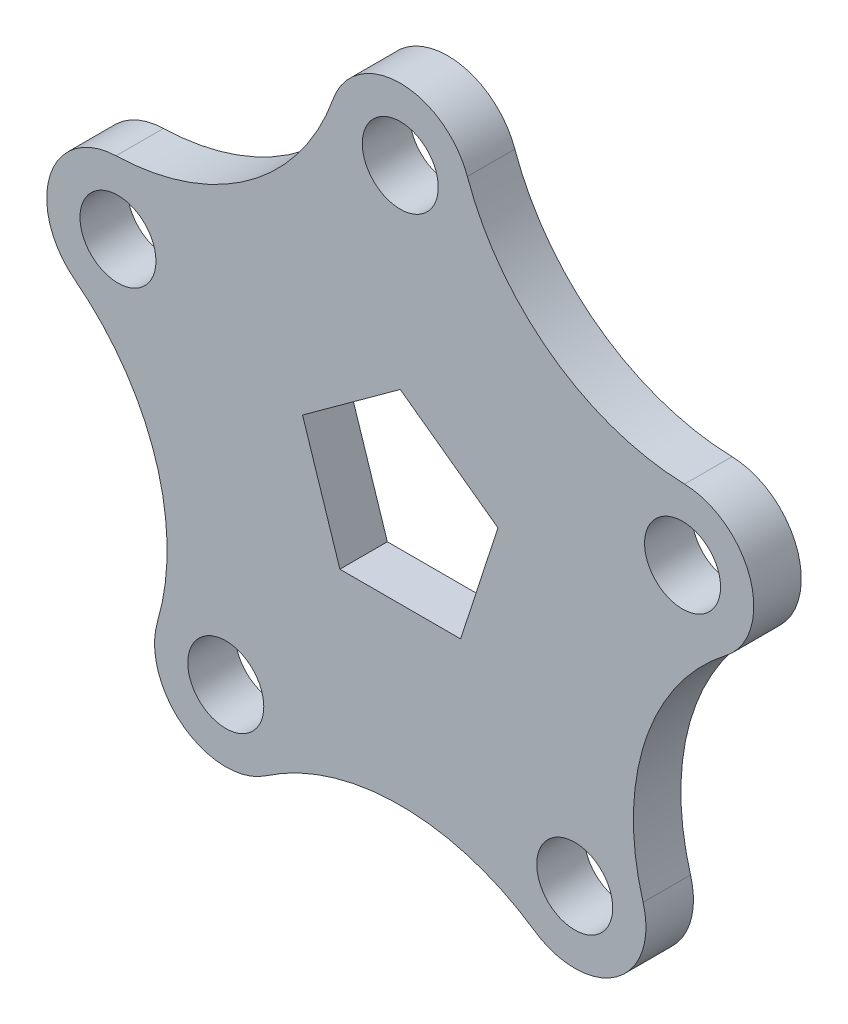
ISO-10303-21;
HEADER;
FILE_DESCRIPTION(('STEP AP214'),'2;1');
FILE_NAME('part.step','',(''),(''),'','','');
FILE_SCHEMA(('AUTOMOTIVE_DESIGN { 1 0 10303 214 1 1 1 1 }'));
ENDSEC;
DATA;
#1=APPLICATION_CONTEXT('core data for automotive mechanical design processes');
#2=APPLICATION_PROTOCOL_DEFINITION('international standard','automotive_design',2000,#1);
#3=PRODUCT_CONTEXT('',#1,'mechanical');
#4=PRODUCT('Part','Part','',(#3));
#5=PRODUCT_RELATED_PRODUCT_CATEGORY('part','',(#4));
#6=PRODUCT_DEFINITION_FORMATION('','',#4);
#7=PRODUCT_DEFINITION_CONTEXT('part definition',#1,'design');
#8=PRODUCT_DEFINITION('design','',#6,#7);
#9=PRODUCT_DEFINITION_SHAPE('','',#8);
#10=(LENGTH_UNIT() NAMED_UNIT(*) SI_UNIT(.MILLI.,.METRE.));
#11=(NAMED_UNIT(*) PLANE_ANGLE_UNIT() SI_UNIT($,.RADIAN.));
#12=(NAMED_UNIT(*) SI_UNIT($,.STERADIAN.) SOLID_ANGLE_UNIT());
#13=UNCERTAINTY_MEASURE_WITH_UNIT(LENGTH_MEASURE(1.E-05),#10,'distance_accuracy_value','');
#14=(GEOMETRIC_REPRESENTATION_CONTEXT(3) GLOBAL_UNCERTAINTY_ASSIGNED_CONTEXT((#13)) GLOBAL_UNIT_ASSIGNED_CONTEXT((#10,
#11,#12)) REPRESENTATION_CONTEXT('',''));
#15=CARTESIAN_POINT('',(0.,0.,0.));
#16=DIRECTION('',(0.,0.,1.));
#17=DIRECTION('',(1.,0.,0.));
#18=AXIS2_PLACEMENT_3D('',#15,#16,#17);
#19=CARTESIAN_POINT('',(16.6434890351652,-5.40779740156155,10.));
#20=DIRECTION('',(-0.951056516295154,0.309016994374946,0.));
#21=DIRECTION('',(-0.309016994374946,-0.951056516295154,0.));
#22=AXIS2_PLACEMENT_3D('',#19,#20,#21);
#23=PLANE('',#22);
#24=DIRECTION('',(0.309016994374946,0.951056516295154,0.));
#25=VECTOR('',#24,1.);
#26=CARTESIAN_POINT('',(16.6434890351652,-5.40779740156155,0.));
#27=LINE('',#26,#25);
#28=CARTESIAN_POINT('',(12.7144942400938,-17.5,0.));
#29=VERTEX_POINT('',#28);
#30=CARTESIAN_POINT('',(20.5724838302366,6.68440519687686,0.));
#31=VERTEX_POINT('',#30);
#32=EDGE_CURVE('E230',#29,#31,#27,.T.);
#33=ORIENTED_EDGE('',*,*,#32,.F.);
#34=DIRECTION('',(0.,0.,-1.));
#35=VECTOR('',#34,1.);
#36=CARTESIAN_POINT('',(12.7144942400938,-17.5,10.));
#37=LINE('',#36,#35);
#38=CARTESIAN_POINT('',(12.7144942400938,-17.5,10.));
#39=VERTEX_POINT('',#38);
#40=EDGE_CURVE('E11',#39,#29,#37,.T.);
#41=ORIENTED_EDGE('',*,*,#40,.F.);
#42=DIRECTION('',(0.309016994374946,0.951056516295154,0.));
#43=VECTOR('',#42,1.);
#44=CARTESIAN_POINT('',(16.6434890351652,-5.40779740156155,10.));
#45=LINE('',#44,#43);
#46=CARTESIAN_POINT('',(20.5724838302366,6.68440519687686,10.));
#47=VERTEX_POINT('',#46);
#48=EDGE_CURVE('E309',#39,#47,#45,.T.);
#49=ORIENTED_EDGE('',*,*,#48,.T.);
#50=DIRECTION('',(0.,0.,-1.));
#51=VECTOR('',#50,1.);
#52=CARTESIAN_POINT('',(20.5724838302366,6.68440519687686,10.));
#53=LINE('',#52,#51);
#54=EDGE_CURVE('E58',#47,#31,#53,.T.);
#55=ORIENTED_EDGE('',*,*,#54,.T.);
#56=EDGE_LOOP('',(#33,#41,#49,#55));
#57=FACE_BOUND('',#56,.T.);
#58=ADVANCED_FACE('F41',(#57),#23,.T.);
#59=CARTESIAN_POINT('',(0.,-17.5,10.));
#60=DIRECTION('',(0.,1.,0.));
#61=DIRECTION('',(-1.,0.,0.));
#62=AXIS2_PLACEMENT_3D('',#59,#60,#61);
#63=PLANE('',#62);
#64=DIRECTION('',(1.,0.,0.));
#65=VECTOR('',#64,1.);
#66=CARTESIAN_POINT('',(0.,-17.5,0.));
#67=LINE('',#66,#65);
#68=CARTESIAN_POINT('',(-12.7144942400938,-17.5,0.));
#69=VERTEX_POINT('',#68);
#70=EDGE_CURVE('E227',#69,#29,#67,.T.);
#71=ORIENTED_EDGE('',*,*,#70,.F.);
#72=DIRECTION('',(0.,0.,-1.));
#73=VECTOR('',#72,1.);
#74=CARTESIAN_POINT('',(-12.7144942400938,-17.5,10.));
#75=LINE('',#74,#73);
#76=CARTESIAN_POINT('',(-12.7144942400938,-17.5,10.));
#77=VERTEX_POINT('',#76);
#78=EDGE_CURVE('E51',#77,#69,#75,.T.);
#79=ORIENTED_EDGE('',*,*,#78,.F.);
#80=DIRECTION('',(1.,0.,0.));
#81=VECTOR('',#80,1.);
#82=CARTESIAN_POINT('',(0.,-17.5,10.));
#83=LINE('',#82,#81);
#84=EDGE_CURVE('E172',#77,#39,#83,.T.);
#85=ORIENTED_EDGE('',*,*,#84,.T.);
#86=ORIENTED_EDGE('',*,*,#40,.T.);
#87=EDGE_LOOP('',(#71,#79,#85,#86));
#88=FACE_BOUND('',#87,.T.);
#89=ADVANCED_FACE('F315',(#88),#63,.T.);
#90=CARTESIAN_POINT('',(-16.6434890351652,-5.4077974015616,10.));
#91=DIRECTION('',(0.951056516295153,0.309016994374948,0.));
#92=DIRECTION('',(-0.309016994374948,0.951056516295153,0.));
#93=AXIS2_PLACEMENT_3D('',#90,#91,#92);
#94=PLANE('',#93);
#95=DIRECTION('',(0.309016994374948,-0.951056516295153,0.));
#96=VECTOR('',#95,1.);
#97=CARTESIAN_POINT('',(-16.6434890351652,-5.4077974015616,0.));
#98=LINE('',#97,#96);
#99=CARTESIAN_POINT('',(-20.5724838302366,6.68440519687681,0.));
#100=VERTEX_POINT('',#99);
#101=EDGE_CURVE('E161',#100,#69,#98,.T.);
#102=ORIENTED_EDGE('',*,*,#101,.F.);
#103=DIRECTION('',(0.,0.,-1.));
#104=VECTOR('',#103,1.);
#105=CARTESIAN_POINT('',(-20.5724838302366,6.68440519687681,10.));
#106=LINE('',#105,#104);
#107=CARTESIAN_POINT('',(-20.5724838302366,6.68440519687681,10.));
#108=VERTEX_POINT('',#107);
#109=EDGE_CURVE('E157',#108,#100,#106,.T.);
#110=ORIENTED_EDGE('',*,*,#109,.F.);
#111=DIRECTION('',(0.309016994374948,-0.951056516295153,0.));
#112=VECTOR('',#111,1.);
#113=CARTESIAN_POINT('',(-16.6434890351652,-5.4077974015616,10.));
#114=LINE('',#113,#112);
#115=EDGE_CURVE('E159',#108,#77,#114,.T.);
#116=ORIENTED_EDGE('',*,*,#115,.T.);
#117=ORIENTED_EDGE('',*,*,#78,.T.);
#118=EDGE_LOOP('',(#102,#110,#116,#117));
#119=FACE_BOUND('',#118,.T.);
#120=ADVANCED_FACE('F156',(#119),#94,.T.);
#121=CARTESIAN_POINT('',(-10.2862419151183,14.1577974015616,10.));
#122=DIRECTION('',(0.587785252292474,-0.809016994374947,0.));
#123=DIRECTION('',(0.809016994374947,0.587785252292474,0.));
#124=AXIS2_PLACEMENT_3D('',#121,#122,#123);
#125=PLANE('',#124);
#126=DIRECTION('',(-0.809016994374947,-0.587785252292474,0.));
#127=VECTOR('',#126,1.);
#128=CARTESIAN_POINT('',(-10.2862419151183,14.1577974015616,0.));
#129=LINE('',#128,#127);
#130=CARTESIAN_POINT('',(0.,21.6311896062463,0.));
#131=VERTEX_POINT('',#130);
#132=EDGE_CURVE('E232',#131,#100,#129,.T.);
#133=ORIENTED_EDGE('',*,*,#132,.F.);
#134=DIRECTION('',(0.,0.,-1.));
#135=VECTOR('',#134,1.);
#136=CARTESIAN_POINT('',(0.,21.6311896062463,10.));
#137=LINE('',#136,#135);
#138=CARTESIAN_POINT('',(0.,21.6311896062463,10.));
#139=VERTEX_POINT('',#138);
#140=EDGE_CURVE('E106',#139,#131,#137,.T.);
#141=ORIENTED_EDGE('',*,*,#140,.F.);
#142=DIRECTION('',(-0.809016994374947,-0.587785252292474,0.));
#143=VECTOR('',#142,1.);
#144=CARTESIAN_POINT('',(-10.2862419151183,14.1577974015616,10.));
#145=LINE('',#144,#143);
#146=EDGE_CURVE('E171',#139,#108,#145,.T.);
#147=ORIENTED_EDGE('',*,*,#146,.T.);
#148=ORIENTED_EDGE('',*,*,#109,.T.);
#149=EDGE_LOOP('',(#133,#141,#147,#148));
#150=FACE_BOUND('',#149,.T.);
#151=ADVANCED_FACE('F180',(#150),#125,.T.);
#152=CARTESIAN_POINT('',(0.,-104.186540591808,10.));
#153=DIRECTION('',(0.,0.,-1.));
#154=DIRECTION('',(-1.,0.,0.));
#155=AXIS2_PLACEMENT_3D('',#152,#153,#154);
#156=CYLINDRICAL_SURFACE('',#155,50.);
#157=CARTESIAN_POINT('',(0.,-104.186540591808,0.));
#158=DIRECTION('',(0.,0.,1.));
#159=DIRECTION('',(1.,0.,0.));
#160=AXIS2_PLACEMENT_3D('',#157,#158,#159);
#161=CIRCLE('',#160,50.);
#162=CARTESIAN_POINT('',(-28.2589063602149,-62.9380956353668,0.));
#163=VERTEX_POINT('',#162);
#164=CARTESIAN_POINT('',(28.2589063602151,-62.9380956353667,0.));
#165=VERTEX_POINT('',#164);
#166=EDGE_CURVE('E198',#163,#165,#161,.F.);
#167=ORIENTED_EDGE('',*,*,#166,.T.);
#168=DIRECTION('',(0.,0.,-1.));
#169=VECTOR('',#168,1.);
#170=CARTESIAN_POINT('',(28.2589063602151,-62.9380956353667,10.));
#171=LINE('',#170,#169);
#172=CARTESIAN_POINT('',(28.2589063602151,-62.9380956353667,10.));
#173=VERTEX_POINT('',#172);
#174=EDGE_CURVE('E44',#173,#165,#171,.T.);
#175=ORIENTED_EDGE('',*,*,#174,.F.);
#176=CARTESIAN_POINT('',(0.,-104.186540591808,10.));
#177=DIRECTION('',(0.,0.,1.));
#178=DIRECTION('',(1.,0.,0.));
#179=AXIS2_PLACEMENT_3D('',#176,#177,#178);
#180=CIRCLE('',#179,50.);
#181=CARTESIAN_POINT('',(-28.2589063602149,-62.9380956353668,10.));
#182=VERTEX_POINT('',#181);
#183=EDGE_CURVE('E295',#182,#173,#180,.F.);
#184=ORIENTED_EDGE('',*,*,#183,.F.);
#185=DIRECTION('',(0.,0.,-1.));
#186=VECTOR('',#185,1.);
#187=CARTESIAN_POINT('',(-28.2589063602149,-62.9380956353668,10.));
#188=LINE('',#187,#186);
#189=EDGE_CURVE('E186',#182,#163,#188,.T.);
#190=ORIENTED_EDGE('',*,*,#189,.T.);
#191=EDGE_LOOP('',(#167,#175,#184,#190));
#192=FACE_BOUND('',#191,.T.);
#193=ADVANCED_FACE('F269',(#192),#156,.F.);
#194=CARTESIAN_POINT('',(36.7365782682796,-50.5635621484342,10.));
#195=DIRECTION('',(0.,0.,-1.));
#196=DIRECTION('',(-1.,0.,0.));
#197=AXIS2_PLACEMENT_3D('',#194,#195,#196);
#198=CYLINDRICAL_SURFACE('',#197,15.);
#199=CARTESIAN_POINT('',(36.7365782682796,-50.5635621484342,0.));
#200=DIRECTION('',(0.,0.,1.));
#201=DIRECTION('',(1.,0.,0.));
#202=AXIS2_PLACEMENT_3D('',#199,#200,#201);
#203=CIRCLE('',#202,15.);
#204=CARTESIAN_POINT('',(51.1252036694662,-46.3247581821812,0.));
#205=VERTEX_POINT('',#204);
#206=EDGE_CURVE('E205',#165,#205,#203,.T.);
#207=ORIENTED_EDGE('',*,*,#206,.T.);
#208=DIRECTION('',(0.,0.,-1.));
#209=VECTOR('',#208,1.);
#210=CARTESIAN_POINT('',(51.1252036694662,-46.3247581821812,10.));
#211=LINE('',#210,#209);
#212=CARTESIAN_POINT('',(51.1252036694662,-46.3247581821812,10.));
#213=VERTEX_POINT('',#212);
#214=EDGE_CURVE('E263',#213,#205,#211,.T.);
#215=ORIENTED_EDGE('',*,*,#214,.F.);
#216=CARTESIAN_POINT('',(36.7365782682796,-50.5635621484342,10.));
#217=DIRECTION('',(0.,0.,1.));
#218=DIRECTION('',(1.,0.,0.));
#219=AXIS2_PLACEMENT_3D('',#216,#217,#218);
#220=CIRCLE('',#219,15.);
#221=EDGE_CURVE('E118',#173,#213,#220,.T.);
#222=ORIENTED_EDGE('',*,*,#221,.F.);
#223=ORIENTED_EDGE('',*,*,#174,.T.);
#224=EDGE_LOOP('',(#207,#215,#222,#223));
#225=FACE_BOUND('',#224,.T.);
#226=ADVANCED_FACE('F266',(#225),#198,.T.);
#227=CARTESIAN_POINT('',(99.0872883400888,-32.1954116280043,10.));
#228=DIRECTION('',(0.,0.,-1.));
#229=DIRECTION('',(-1.,0.,0.));
#230=AXIS2_PLACEMENT_3D('',#227,#228,#229);
#231=CYLINDRICAL_SURFACE('',#230,50.);
#232=CARTESIAN_POINT('',(99.0872883400888,-32.1954116280043,0.));
#233=DIRECTION('',(0.,0.,1.));
#234=DIRECTION('',(1.,0.,0.));
#235=AXIS2_PLACEMENT_3D('',#232,#233,#234);
#236=CIRCLE('',#235,50.);
#237=CARTESIAN_POINT('',(68.5901682849797,7.42687589233294,0.));
#238=VERTEX_POINT('',#237);
#239=EDGE_CURVE('E203',#238,#205,#236,.T.);
#240=ORIENTED_EDGE('',*,*,#239,.F.);
#241=DIRECTION('',(0.,0.,-1.));
#242=VECTOR('',#241,1.);
#243=CARTESIAN_POINT('',(68.5901682849797,7.42687589233294,10.));
#244=LINE('',#243,#242);
#245=CARTESIAN_POINT('',(68.5901682849797,7.42687589233294,10.));
#246=VERTEX_POINT('',#245);
#247=EDGE_CURVE('E259',#246,#238,#244,.T.);
#248=ORIENTED_EDGE('',*,*,#247,.F.);
#249=CARTESIAN_POINT('',(99.0872883400888,-32.1954116280043,10.));
#250=DIRECTION('',(0.,0.,1.));
#251=DIRECTION('',(1.,0.,0.));
#252=AXIS2_PLACEMENT_3D('',#249,#250,#251);
#253=CIRCLE('',#252,50.);
#254=EDGE_CURVE('E282',#246,#213,#253,.T.);
#255=ORIENTED_EDGE('',*,*,#254,.T.);
#256=ORIENTED_EDGE('',*,*,#214,.T.);
#257=EDGE_LOOP('',(#240,#248,#255,#256));
#258=FACE_BOUND('',#257,.T.);
#259=ADVANCED_FACE('F277',(#258),#231,.F.);
#260=CARTESIAN_POINT('',(59.4410322684471,19.3135621484343,10.));
#261=DIRECTION('',(0.,0.,-1.));
#262=DIRECTION('',(-1.,0.,0.));
#263=AXIS2_PLACEMENT_3D('',#260,#261,#262);
#264=CYLINDRICAL_SURFACE('',#263,15.0000000000001);
#265=CARTESIAN_POINT('',(59.4410322684471,19.3135621484343,0.));
#266=DIRECTION('',(0.,0.,1.));
#267=DIRECTION('',(1.,0.,0.));
#268=AXIS2_PLACEMENT_3D('',#265,#266,#267);
#269=CIRCLE('',#268,15.0000000000001);
#270=CARTESIAN_POINT('',(59.856019909706,34.3078205581591,0.));
#271=VERTEX_POINT('',#270);
#272=EDGE_CURVE('E209',#238,#271,#269,.T.);
#273=ORIENTED_EDGE('',*,*,#272,.T.);
#274=DIRECTION('',(0.,0.,-1.));
#275=VECTOR('',#274,1.);
#276=CARTESIAN_POINT('',(59.856019909706,34.3078205581591,10.));
#277=LINE('',#276,#275);
#278=CARTESIAN_POINT('',(59.856019909706,34.3078205581591,10.));
#279=VERTEX_POINT('',#278);
#280=EDGE_CURVE('E256',#279,#271,#277,.T.);
#281=ORIENTED_EDGE('',*,*,#280,.F.);
#282=CARTESIAN_POINT('',(59.4410322684471,19.3135621484343,10.));
#283=DIRECTION('',(0.,0.,1.));
#284=DIRECTION('',(1.,0.,0.));
#285=AXIS2_PLACEMENT_3D('',#282,#283,#284);
#286=CIRCLE('',#285,15.0000000000001);
#287=EDGE_CURVE('E281',#246,#279,#286,.T.);
#288=ORIENTED_EDGE('',*,*,#287,.F.);
#289=ORIENTED_EDGE('',*,*,#247,.T.);
#290=EDGE_LOOP('',(#273,#281,#288,#289));
#291=FACE_BOUND('',#290,.T.);
#292=ADVANCED_FACE('F283',(#291),#264,.T.);
#293=CARTESIAN_POINT('',(61.2393120472359,84.2886819239084,10.));
#294=DIRECTION('',(0.,0.,-1.));
#295=DIRECTION('',(-1.,0.,0.));
#296=AXIS2_PLACEMENT_3D('',#293,#294,#295);
#297=CYLINDRICAL_SURFACE('',#296,50.);
#298=CARTESIAN_POINT('',(61.2393120472359,84.2886819239084,0.));
#299=DIRECTION('',(0.,0.,1.));
#300=DIRECTION('',(1.,0.,0.));
#301=AXIS2_PLACEMENT_3D('',#298,#299,#300);
#302=CIRCLE('',#301,50.);
#303=CARTESIAN_POINT('',(14.1321489339775,67.5281573670558,0.));
#304=VERTEX_POINT('',#303);
#305=EDGE_CURVE('E213',#304,#271,#302,.T.);
#306=ORIENTED_EDGE('',*,*,#305,.F.);
#307=DIRECTION('',(0.,0.,-1.));
#308=VECTOR('',#307,1.);
#309=CARTESIAN_POINT('',(14.1321489339775,67.5281573670558,10.));
#310=LINE('',#309,#308);
#311=CARTESIAN_POINT('',(14.1321489339775,67.5281573670558,10.));
#312=VERTEX_POINT('',#311);
#313=EDGE_CURVE('E258',#312,#304,#310,.T.);
#314=ORIENTED_EDGE('',*,*,#313,.F.);
#315=CARTESIAN_POINT('',(61.2393120472359,84.2886819239084,10.));
#316=DIRECTION('',(0.,0.,1.));
#317=DIRECTION('',(1.,0.,0.));
#318=AXIS2_PLACEMENT_3D('',#315,#316,#317);
#319=CIRCLE('',#318,50.);
#320=EDGE_CURVE('E288',#312,#279,#319,.T.);
#321=ORIENTED_EDGE('',*,*,#320,.T.);
#322=ORIENTED_EDGE('',*,*,#280,.T.);
#323=EDGE_LOOP('',(#306,#314,#321,#322));
#324=FACE_BOUND('',#323,.T.);
#325=ADVANCED_FACE('F350',(#324),#297,.F.);
#326=CARTESIAN_POINT('',(0.,62.5,10.));
#327=DIRECTION('',(0.,0.,-1.));
#328=DIRECTION('',(-1.,0.,0.));
#329=AXIS2_PLACEMENT_3D('',#326,#327,#328);
#330=CYLINDRICAL_SURFACE('',#329,15.);
#331=CARTESIAN_POINT('',(0.,62.5,0.));
#332=DIRECTION('',(0.,0.,1.));
#333=DIRECTION('',(1.,0.,0.));
#334=AXIS2_PLACEMENT_3D('',#331,#332,#333);
#335=CIRCLE('',#334,15.);
#336=CARTESIAN_POINT('',(-14.1321489339776,67.5281573670557,0.));
#337=VERTEX_POINT('',#336);
#338=EDGE_CURVE('E215',#304,#337,#335,.T.);
#339=ORIENTED_EDGE('',*,*,#338,.T.);
#340=DIRECTION('',(0.,0.,-1.));
#341=VECTOR('',#340,1.);
#342=CARTESIAN_POINT('',(-14.1321489339776,67.5281573670557,10.));
#343=LINE('',#342,#341);
#344=CARTESIAN_POINT('',(-14.1321489339776,67.5281573670557,10.));
#345=VERTEX_POINT('',#344);
#346=EDGE_CURVE('E253',#345,#337,#343,.T.);
#347=ORIENTED_EDGE('',*,*,#346,.F.);
#348=CARTESIAN_POINT('',(0.,62.5,10.));
#349=DIRECTION('',(0.,0.,1.));
#350=DIRECTION('',(1.,0.,0.));
#351=AXIS2_PLACEMENT_3D('',#348,#349,#350);
#352=CIRCLE('',#351,15.);
#353=EDGE_CURVE('E297',#312,#345,#352,.T.);
#354=ORIENTED_EDGE('',*,*,#353,.F.);
#355=ORIENTED_EDGE('',*,*,#313,.T.);
#356=EDGE_LOOP('',(#339,#347,#354,#355));
#357=FACE_BOUND('',#356,.T.);
#358=ADVANCED_FACE('F345',(#357),#330,.T.);
#359=CARTESIAN_POINT('',(-61.2393120472362,84.2886819239082,10.));
#360=DIRECTION('',(0.,0.,-1.));
#361=DIRECTION('',(-1.,0.,0.));
#362=AXIS2_PLACEMENT_3D('',#359,#360,#361);
#363=CYLINDRICAL_SURFACE('',#362,50.);
#364=CARTESIAN_POINT('',(-61.2393120472362,84.2886819239082,0.));
#365=DIRECTION('',(0.,0.,1.));
#366=DIRECTION('',(1.,0.,0.));
#367=AXIS2_PLACEMENT_3D('',#364,#365,#366);
#368=CIRCLE('',#367,50.);
#369=CARTESIAN_POINT('',(-59.8560199097062,34.3078205581589,0.));
#370=VERTEX_POINT('',#369);
#371=EDGE_CURVE('E220',#370,#337,#368,.T.);
#372=ORIENTED_EDGE('',*,*,#371,.F.);
#373=DIRECTION('',(0.,0.,-1.));
#374=VECTOR('',#373,1.);
#375=CARTESIAN_POINT('',(-59.8560199097062,34.3078205581589,10.));
#376=LINE('',#375,#374);
#377=CARTESIAN_POINT('',(-59.8560199097062,34.3078205581589,10.));
#378=VERTEX_POINT('',#377);
#379=EDGE_CURVE('E252',#378,#370,#376,.T.);
#380=ORIENTED_EDGE('',*,*,#379,.F.);
#381=CARTESIAN_POINT('',(-61.2393120472362,84.2886819239082,10.));
#382=DIRECTION('',(0.,0.,1.));
#383=DIRECTION('',(1.,0.,0.));
#384=AXIS2_PLACEMENT_3D('',#381,#382,#383);
#385=CIRCLE('',#384,50.);
#386=EDGE_CURVE('E298',#378,#345,#385,.T.);
#387=ORIENTED_EDGE('',*,*,#386,.T.);
#388=ORIENTED_EDGE('',*,*,#346,.T.);
#389=EDGE_LOOP('',(#372,#380,#387,#388));
#390=FACE_BOUND('',#389,.T.);
#391=ADVANCED_FACE('F341',(#390),#363,.F.);
#392=CARTESIAN_POINT('',(-59.4410322684471,19.3135621484341,10.));
#393=DIRECTION('',(0.,0.,-1.));
#394=DIRECTION('',(-1.,0.,0.));
#395=AXIS2_PLACEMENT_3D('',#392,#393,#394);
#396=CYLINDRICAL_SURFACE('',#395,15.);
#397=CARTESIAN_POINT('',(-59.4410322684471,19.3135621484341,0.));
#398=DIRECTION('',(0.,0.,1.));
#399=DIRECTION('',(1.,0.,0.));
#400=AXIS2_PLACEMENT_3D('',#397,#398,#399);
#401=CIRCLE('',#400,15.);
#402=CARTESIAN_POINT('',(-68.5901682849798,7.42687589233301,0.));
#403=VERTEX_POINT('',#402);
#404=EDGE_CURVE('E217',#403,#370,#401,.F.);
#405=ORIENTED_EDGE('',*,*,#404,.F.);
#406=DIRECTION('',(0.,0.,-1.));
#407=VECTOR('',#406,1.);
#408=CARTESIAN_POINT('',(-68.5901682849798,7.42687589233301,10.));
#409=LINE('',#408,#407);
#410=CARTESIAN_POINT('',(-68.5901682849798,7.42687589233301,10.));
#411=VERTEX_POINT('',#410);
#412=EDGE_CURVE('E248',#411,#403,#409,.T.);
#413=ORIENTED_EDGE('',*,*,#412,.F.);
#414=CARTESIAN_POINT('',(-59.4410322684471,19.3135621484341,10.));
#415=DIRECTION('',(0.,0.,1.));
#416=DIRECTION('',(1.,0.,0.));
#417=AXIS2_PLACEMENT_3D('',#414,#415,#416);
#418=CIRCLE('',#417,15.);
#419=EDGE_CURVE('E302',#411,#378,#418,.F.);
#420=ORIENTED_EDGE('',*,*,#419,.T.);
#421=ORIENTED_EDGE('',*,*,#379,.T.);
#422=EDGE_LOOP('',(#405,#413,#420,#421));
#423=FACE_BOUND('',#422,.T.);
#424=ADVANCED_FACE('F327',(#423),#396,.T.);
#425=CARTESIAN_POINT('',(-99.0872883400889,-32.1954116280042,10.));
#426=DIRECTION('',(0.,0.,-1.));
#427=DIRECTION('',(-1.,0.,0.));
#428=AXIS2_PLACEMENT_3D('',#425,#426,#427);
#429=CYLINDRICAL_SURFACE('',#428,50.);
#430=CARTESIAN_POINT('',(-99.0872883400889,-32.1954116280042,0.));
#431=DIRECTION('',(0.,0.,1.));
#432=DIRECTION('',(1.,0.,0.));
#433=AXIS2_PLACEMENT_3D('',#430,#431,#432);
#434=CIRCLE('',#433,50.);
#435=CARTESIAN_POINT('',(-51.1252036694663,-46.3247581821811,0.));
#436=VERTEX_POINT('',#435);
#437=EDGE_CURVE('E223',#403,#436,#434,.F.);
#438=ORIENTED_EDGE('',*,*,#437,.T.);
#439=DIRECTION('',(0.,0.,-1.));
#440=VECTOR('',#439,1.);
#441=CARTESIAN_POINT('',(-51.1252036694663,-46.3247581821811,10.));
#442=LINE('',#441,#440);
#443=CARTESIAN_POINT('',(-51.1252036694663,-46.3247581821811,10.));
#444=VERTEX_POINT('',#443);
#445=EDGE_CURVE('E250',#444,#436,#442,.T.);
#446=ORIENTED_EDGE('',*,*,#445,.F.);
#447=CARTESIAN_POINT('',(-99.0872883400889,-32.1954116280042,10.));
#448=DIRECTION('',(0.,0.,1.));
#449=DIRECTION('',(1.,0.,0.));
#450=AXIS2_PLACEMENT_3D('',#447,#448,#449);
#451=CIRCLE('',#450,50.);
#452=EDGE_CURVE('E304',#411,#444,#451,.F.);
#453=ORIENTED_EDGE('',*,*,#452,.F.);
#454=ORIENTED_EDGE('',*,*,#412,.T.);
#455=EDGE_LOOP('',(#438,#446,#453,#454));
#456=FACE_BOUND('',#455,.T.);
#457=ADVANCED_FACE('F320',(#456),#429,.F.);
#458=CARTESIAN_POINT('',(10.2862419151183,14.1577974015616,10.));
#459=DIRECTION('',(-0.587785252292472,-0.809016994374948,0.));
#460=DIRECTION('',(0.809016994374948,-0.587785252292472,0.));
#461=AXIS2_PLACEMENT_3D('',#458,#459,#460);
#462=PLANE('',#461);
#463=DIRECTION('',(-0.809016994374948,0.587785252292472,0.));
#464=VECTOR('',#463,1.);
#465=CARTESIAN_POINT('',(10.2862419151183,14.1577974015616,0.));
#466=LINE('',#465,#464);
#467=EDGE_CURVE('E234',#31,#131,#466,.T.);
#468=ORIENTED_EDGE('',*,*,#467,.F.);
#469=ORIENTED_EDGE('',*,*,#54,.F.);
#470=DIRECTION('',(-0.809016994374948,0.587785252292472,0.));
#471=VECTOR('',#470,1.);
#472=CARTESIAN_POINT('',(10.2862419151183,14.1577974015616,10.));
#473=LINE('',#472,#471);
#474=EDGE_CURVE('E178',#47,#139,#473,.T.);
#475=ORIENTED_EDGE('',*,*,#474,.T.);
#476=ORIENTED_EDGE('',*,*,#140,.T.);
#477=EDGE_LOOP('',(#468,#469,#475,#476));
#478=FACE_BOUND('',#477,.T.);
#479=ADVANCED_FACE('F312',(#478),#462,.T.);
#480=CARTESIAN_POINT('',(-36.7365782682795,-50.5635621484343,10.));
#481=DIRECTION('',(0.,0.,-1.));
#482=DIRECTION('',(-1.,0.,0.));
#483=AXIS2_PLACEMENT_3D('',#480,#481,#482);
#484=CYLINDRICAL_SURFACE('',#483,15.0000000000001);
#485=CARTESIAN_POINT('',(-36.7365782682795,-50.5635621484343,0.));
#486=DIRECTION('',(0.,0.,1.));
#487=DIRECTION('',(1.,0.,0.));
#488=AXIS2_PLACEMENT_3D('',#485,#486,#487);
#489=CIRCLE('',#488,15.0000000000001);
#490=EDGE_CURVE('E224',#436,#163,#489,.T.);
#491=ORIENTED_EDGE('',*,*,#490,.T.);
#492=ORIENTED_EDGE('',*,*,#189,.F.);
#493=CARTESIAN_POINT('',(-36.7365782682795,-50.5635621484343,10.));
#494=DIRECTION('',(0.,0.,1.));
#495=DIRECTION('',(1.,0.,0.));
#496=AXIS2_PLACEMENT_3D('',#493,#494,#495);
#497=CIRCLE('',#496,15.0000000000001);
#498=EDGE_CURVE('E310',#444,#182,#497,.T.);
#499=ORIENTED_EDGE('',*,*,#498,.F.);
#500=ORIENTED_EDGE('',*,*,#445,.T.);
#501=EDGE_LOOP('',(#491,#492,#499,#500));
#502=FACE_BOUND('',#501,.T.);
#503=ADVANCED_FACE('F316',(#502),#484,.T.);
#504=CARTESIAN_POINT('',(59.4410322684471,19.3135621484343,10.));
#505=DIRECTION('',(0.,0.,-1.));
#506=DIRECTION('',(-1.,0.,0.));
#507=AXIS2_PLACEMENT_3D('',#504,#505,#506);
#508=CYLINDRICAL_SURFACE('',#507,8.00000000000026);
#509=CARTESIAN_POINT('',(59.4410322684471,19.3135621484343,10.));
#510=DIRECTION('',(0.,0.,1.));
#511=DIRECTION('',(1.,0.,0.));
#512=AXIS2_PLACEMENT_3D('',#509,#510,#511);
#513=CIRCLE('',#512,8.00000000000026);
#514=CARTESIAN_POINT('',(67.4410322684473,19.3135621484343,10.));
#515=VERTEX_POINT('',#514);
#516=EDGE_CURVE('E552',#515,#515,#513,.T.);
#517=ORIENTED_EDGE('',*,*,#516,.T.);
#518=EDGE_LOOP('',(#517));
#519=FACE_BOUND('',#518,.T.);
#520=CARTESIAN_POINT('',(59.4410322684471,19.3135621484343,0.));
#521=DIRECTION('',(0.,0.,1.));
#522=DIRECTION('',(1.,0.,0.));
#523=AXIS2_PLACEMENT_3D('',#520,#521,#522);
#524=CIRCLE('',#523,8.00000000000026);
#525=CARTESIAN_POINT('',(67.4410322684473,19.3135621484343,0.));
#526=VERTEX_POINT('',#525);
#527=EDGE_CURVE('E196',#526,#526,#524,.T.);
#528=ORIENTED_EDGE('',*,*,#527,.F.);
#529=EDGE_LOOP('',(#528));
#530=FACE_BOUND('',#529,.T.);
#531=ADVANCED_FACE('F322',(#519,#530),#508,.F.);
#532=CARTESIAN_POINT('',(-59.4410322684471,19.3135621484341,10.));
#533=DIRECTION('',(0.,0.,-1.));
#534=DIRECTION('',(-1.,0.,0.));
#535=AXIS2_PLACEMENT_3D('',#532,#533,#534);
#536=CYLINDRICAL_SURFACE('',#535,8.0000000000001);
#537=CARTESIAN_POINT('',(-59.4410322684471,19.3135621484341,10.));
#538=DIRECTION('',(0.,0.,1.));
#539=DIRECTION('',(1.,0.,0.));
#540=AXIS2_PLACEMENT_3D('',#537,#538,#539);
#541=CIRCLE('',#540,8.0000000000001);
#542=CARTESIAN_POINT('',(-51.441032268447,19.3135621484341,10.));
#543=VERTEX_POINT('',#542);
#544=EDGE_CURVE('E547',#543,#543,#541,.F.);
#545=ORIENTED_EDGE('',*,*,#544,.F.);
#546=EDGE_LOOP('',(#545));
#547=FACE_BOUND('',#546,.T.);
#548=CARTESIAN_POINT('',(-59.4410322684471,19.3135621484341,0.));
#549=DIRECTION('',(0.,0.,1.));
#550=DIRECTION('',(1.,0.,0.));
#551=AXIS2_PLACEMENT_3D('',#548,#549,#550);
#552=CIRCLE('',#551,8.0000000000001);
#553=CARTESIAN_POINT('',(-51.441032268447,19.3135621484341,0.));
#554=VERTEX_POINT('',#553);
#555=EDGE_CURVE('E194',#554,#554,#552,.F.);
#556=ORIENTED_EDGE('',*,*,#555,.T.);
#557=EDGE_LOOP('',(#556));
#558=FACE_BOUND('',#557,.T.);
#559=ADVANCED_FACE('F362',(#547,#558),#536,.F.);
#560=CARTESIAN_POINT('',(-36.7365782682795,-50.5635621484343,10.));
#561=DIRECTION('',(0.,0.,-1.));
#562=DIRECTION('',(-1.,0.,0.));
#563=AXIS2_PLACEMENT_3D('',#560,#561,#562);
#564=CYLINDRICAL_SURFACE('',#563,8.00000000000015);
#565=CARTESIAN_POINT('',(-36.7365782682795,-50.5635621484343,10.));
#566=DIRECTION('',(0.,0.,1.));
#567=DIRECTION('',(1.,0.,0.));
#568=AXIS2_PLACEMENT_3D('',#565,#566,#567);
#569=CIRCLE('',#568,8.00000000000015);
#570=CARTESIAN_POINT('',(-28.7365782682793,-50.5635621484343,10.));
#571=VERTEX_POINT('',#570);
#572=EDGE_CURVE('E378',#571,#571,#569,.T.);
#573=ORIENTED_EDGE('',*,*,#572,.T.);
#574=EDGE_LOOP('',(#573));
#575=FACE_BOUND('',#574,.T.);
#576=CARTESIAN_POINT('',(-36.7365782682795,-50.5635621484343,0.));
#577=DIRECTION('',(0.,0.,1.));
#578=DIRECTION('',(1.,0.,0.));
#579=AXIS2_PLACEMENT_3D('',#576,#577,#578);
#580=CIRCLE('',#579,8.00000000000015);
#581=CARTESIAN_POINT('',(-28.7365782682793,-50.5635621484343,0.));
#582=VERTEX_POINT('',#581);
#583=EDGE_CURVE('E189',#582,#582,#580,.T.);
#584=ORIENTED_EDGE('',*,*,#583,.F.);
#585=EDGE_LOOP('',(#584));
#586=FACE_BOUND('',#585,.T.);
#587=ADVANCED_FACE('F370',(#575,#586),#564,.F.);
#588=CARTESIAN_POINT('',(36.7365782682796,-50.5635621484342,10.));
#589=DIRECTION('',(0.,0.,-1.));
#590=DIRECTION('',(-1.,0.,0.));
#591=AXIS2_PLACEMENT_3D('',#588,#589,#590);
#592=CYLINDRICAL_SURFACE('',#591,8.00000000000005);
#593=CARTESIAN_POINT('',(36.7365782682796,-50.5635621484342,10.));
#594=DIRECTION('',(0.,0.,1.));
#595=DIRECTION('',(1.,0.,0.));
#596=AXIS2_PLACEMENT_3D('',#593,#594,#595);
#597=CIRCLE('',#596,8.00000000000005);
#598=CARTESIAN_POINT('',(44.7365782682797,-50.5635621484342,10.));
#599=VERTEX_POINT('',#598);
#600=EDGE_CURVE('E241',#599,#599,#597,.T.);
#601=ORIENTED_EDGE('',*,*,#600,.T.);
#602=EDGE_LOOP('',(#601));
#603=FACE_BOUND('',#602,.T.);
#604=CARTESIAN_POINT('',(36.7365782682796,-50.5635621484342,0.));
#605=DIRECTION('',(0.,0.,1.));
#606=DIRECTION('',(1.,0.,0.));
#607=AXIS2_PLACEMENT_3D('',#604,#605,#606);
#608=CIRCLE('',#607,8.00000000000005);
#609=CARTESIAN_POINT('',(44.7365782682797,-50.5635621484342,0.));
#610=VERTEX_POINT('',#609);
#611=EDGE_CURVE('E190',#610,#610,#608,.T.);
#612=ORIENTED_EDGE('',*,*,#611,.F.);
#613=EDGE_LOOP('',(#612));
#614=FACE_BOUND('',#613,.T.);
#615=ADVANCED_FACE('F43',(#603,#614),#592,.F.);
#616=CARTESIAN_POINT('',(0.,62.5,10.));
#617=DIRECTION('',(0.,0.,-1.));
#618=DIRECTION('',(-1.,0.,0.));
#619=AXIS2_PLACEMENT_3D('',#616,#617,#618);
#620=CYLINDRICAL_SURFACE('',#619,8.);
#621=CARTESIAN_POINT('',(0.,62.5,10.));
#622=DIRECTION('',(0.,0.,1.));
#623=DIRECTION('',(1.,0.,0.));
#624=AXIS2_PLACEMENT_3D('',#621,#622,#623);
#625=CIRCLE('',#624,8.);
#626=CARTESIAN_POINT('',(8.,62.5,10.));
#627=VERTEX_POINT('',#626);
#628=EDGE_CURVE('E179',#627,#627,#625,.T.);
#629=ORIENTED_EDGE('',*,*,#628,.T.);
#630=EDGE_LOOP('',(#629));
#631=FACE_BOUND('',#630,.T.);
#632=CARTESIAN_POINT('',(0.,62.5,0.));
#633=DIRECTION('',(0.,0.,1.));
#634=DIRECTION('',(1.,0.,0.));
#635=AXIS2_PLACEMENT_3D('',#632,#633,#634);
#636=CIRCLE('',#635,8.);
#637=CARTESIAN_POINT('',(8.,62.5,0.));
#638=VERTEX_POINT('',#637);
#639=EDGE_CURVE('E239',#638,#638,#636,.T.);
#640=ORIENTED_EDGE('',*,*,#639,.F.);
#641=EDGE_LOOP('',(#640));
#642=FACE_BOUND('',#641,.T.);
#643=ADVANCED_FACE('F371',(#631,#642),#620,.F.);
#644=CARTESIAN_POINT('',(0.,0.,10.));
#645=DIRECTION('',(0.,0.,1.));
#646=DIRECTION('',(1.,0.,0.));
#647=AXIS2_PLACEMENT_3D('',#644,#645,#646);
#648=PLANE('',#647);
#649=ORIENTED_EDGE('',*,*,#600,.F.);
#650=EDGE_LOOP('',(#649));
#651=FACE_BOUND('',#650,.T.);
#652=ORIENTED_EDGE('',*,*,#572,.F.);
#653=EDGE_LOOP('',(#652));
#654=FACE_BOUND('',#653,.T.);
#655=ORIENTED_EDGE('',*,*,#544,.T.);
#656=EDGE_LOOP('',(#655));
#657=FACE_BOUND('',#656,.T.);
#658=ORIENTED_EDGE('',*,*,#516,.F.);
#659=EDGE_LOOP('',(#658));
#660=FACE_BOUND('',#659,.T.);
#661=ORIENTED_EDGE('',*,*,#183,.T.);
#662=ORIENTED_EDGE('',*,*,#221,.T.);
#663=ORIENTED_EDGE('',*,*,#254,.F.);
#664=ORIENTED_EDGE('',*,*,#287,.T.);
#665=ORIENTED_EDGE('',*,*,#320,.F.);
#666=ORIENTED_EDGE('',*,*,#353,.T.);
#667=ORIENTED_EDGE('',*,*,#386,.F.);
#668=ORIENTED_EDGE('',*,*,#419,.F.);
#669=ORIENTED_EDGE('',*,*,#452,.T.);
#670=ORIENTED_EDGE('',*,*,#498,.T.);
#671=EDGE_LOOP('',(#661,#662,#663,#664,#665,#666,#667,#668,#669,#670));
#672=FACE_BOUND('',#671,.T.);
#673=ORIENTED_EDGE('',*,*,#48,.F.);
#674=ORIENTED_EDGE('',*,*,#84,.F.);
#675=ORIENTED_EDGE('',*,*,#115,.F.);
#676=ORIENTED_EDGE('',*,*,#146,.F.);
#677=ORIENTED_EDGE('',*,*,#474,.F.);
#678=EDGE_LOOP('',(#673,#674,#675,#676,#677));
#679=FACE_BOUND('',#678,.T.);
#680=ORIENTED_EDGE('',*,*,#628,.F.);
#681=EDGE_LOOP('',(#680));
#682=FACE_BOUND('',#681,.T.);
#683=ADVANCED_FACE('F169',(#651,#654,#657,#660,#672,#679,#682),#648,.T.);
#684=CARTESIAN_POINT('',(0.,0.,0.));
#685=DIRECTION('',(0.,0.,1.));
#686=DIRECTION('',(1.,0.,0.));
#687=AXIS2_PLACEMENT_3D('',#684,#685,#686);
#688=PLANE('',#687);
#689=ORIENTED_EDGE('',*,*,#611,.T.);
#690=EDGE_LOOP('',(#689));
#691=FACE_BOUND('',#690,.T.);
#692=ORIENTED_EDGE('',*,*,#583,.T.);
#693=EDGE_LOOP('',(#692));
#694=FACE_BOUND('',#693,.T.);
#695=ORIENTED_EDGE('',*,*,#555,.F.);
#696=EDGE_LOOP('',(#695));
#697=FACE_BOUND('',#696,.T.);
#698=ORIENTED_EDGE('',*,*,#527,.T.);
#699=EDGE_LOOP('',(#698));
#700=FACE_BOUND('',#699,.T.);
#701=ORIENTED_EDGE('',*,*,#166,.F.);
#702=ORIENTED_EDGE('',*,*,#490,.F.);
#703=ORIENTED_EDGE('',*,*,#437,.F.);
#704=ORIENTED_EDGE('',*,*,#404,.T.);
#705=ORIENTED_EDGE('',*,*,#371,.T.);
#706=ORIENTED_EDGE('',*,*,#338,.F.);
#707=ORIENTED_EDGE('',*,*,#305,.T.);
#708=ORIENTED_EDGE('',*,*,#272,.F.);
#709=ORIENTED_EDGE('',*,*,#239,.T.);
#710=ORIENTED_EDGE('',*,*,#206,.F.);
#711=EDGE_LOOP('',(#701,#702,#703,#704,#705,#706,#707,#708,#709,#710));
#712=FACE_BOUND('',#711,.T.);
#713=ORIENTED_EDGE('',*,*,#32,.T.);
#714=ORIENTED_EDGE('',*,*,#467,.T.);
#715=ORIENTED_EDGE('',*,*,#132,.T.);
#716=ORIENTED_EDGE('',*,*,#101,.T.);
#717=ORIENTED_EDGE('',*,*,#70,.T.);
#718=EDGE_LOOP('',(#713,#714,#715,#716,#717));
#719=FACE_BOUND('',#718,.T.);
#720=ORIENTED_EDGE('',*,*,#639,.T.);
#721=EDGE_LOOP('',(#720));
#722=FACE_BOUND('',#721,.T.);
#723=ADVANCED_FACE('F272',(#691,#694,#697,#700,#712,#719,#722),#688,.F.);
#724=CLOSED_SHELL('',(#58,#89,#120,#151,#193,#226,#259,#292,#325,#358,#391,#424,#457,#479,#503,
#531,#559,#587,#615,#643,#683,#723));
#725=MANIFOLD_SOLID_BREP('B2',#724);
#726=ADVANCED_BREP_SHAPE_REPRESENTATION('',(#18,#725),#14);
#727=SHAPE_DEFINITION_REPRESENTATION(#9,#726);
ENDSEC;
END-ISO-10303-21;
